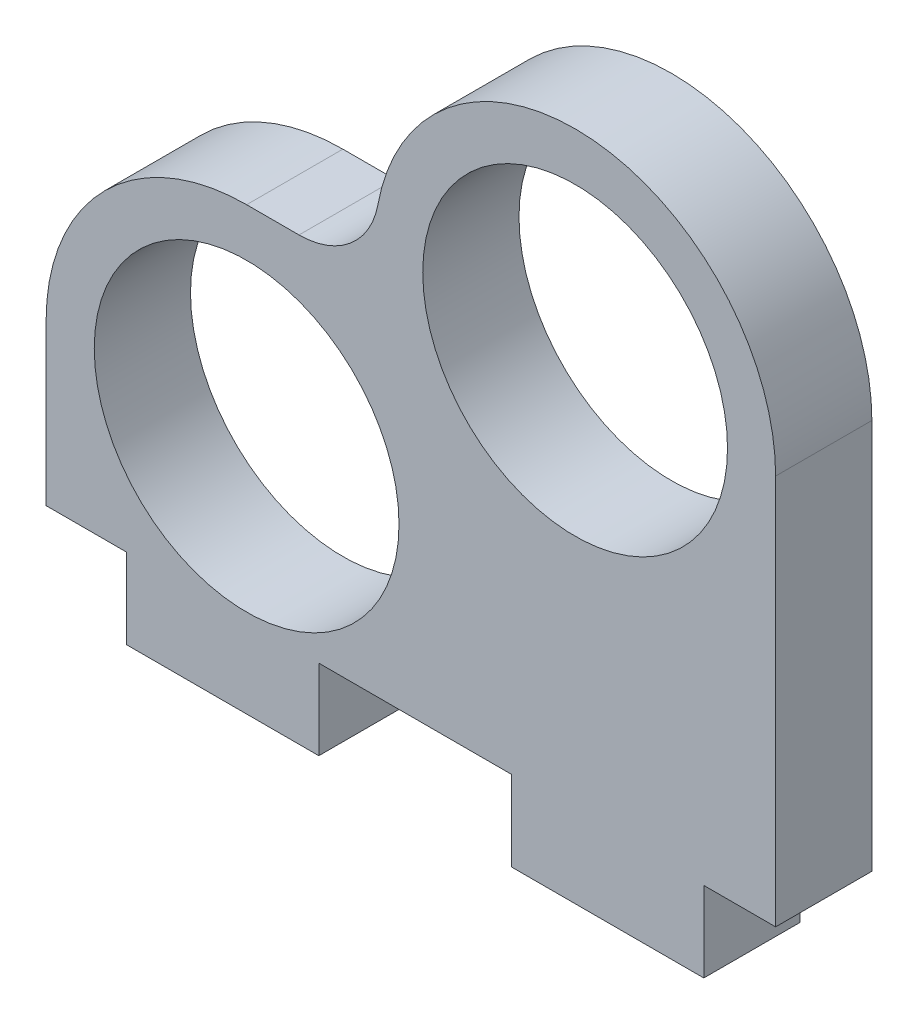
ISO-10303-21;
HEADER;
FILE_DESCRIPTION(('STEP AP214'),'2;1');
FILE_NAME('part.step','',(''),(''),'','','');
FILE_SCHEMA(('AUTOMOTIVE_DESIGN { 1 0 10303 214 1 1 1 1 }'));
ENDSEC;
DATA;
#1=APPLICATION_CONTEXT('core data for automotive mechanical design processes');
#2=APPLICATION_PROTOCOL_DEFINITION('international standard','automotive_design',2000,#1);
#3=PRODUCT_CONTEXT('',#1,'mechanical');
#4=PRODUCT('Part','Part','',(#3));
#5=PRODUCT_RELATED_PRODUCT_CATEGORY('part','',(#4));
#6=PRODUCT_DEFINITION_FORMATION('','',#4);
#7=PRODUCT_DEFINITION_CONTEXT('part definition',#1,'design');
#8=PRODUCT_DEFINITION('design','',#6,#7);
#9=PRODUCT_DEFINITION_SHAPE('','',#8);
#10=(LENGTH_UNIT() NAMED_UNIT(*) SI_UNIT(.MILLI.,.METRE.));
#11=(NAMED_UNIT(*) PLANE_ANGLE_UNIT() SI_UNIT($,.RADIAN.));
#12=(NAMED_UNIT(*) SI_UNIT($,.STERADIAN.) SOLID_ANGLE_UNIT());
#13=UNCERTAINTY_MEASURE_WITH_UNIT(LENGTH_MEASURE(1.E-05),#10,'distance_accuracy_value','');
#14=(GEOMETRIC_REPRESENTATION_CONTEXT(3) GLOBAL_UNCERTAINTY_ASSIGNED_CONTEXT((#13)) GLOBAL_UNIT_ASSIGNED_CONTEXT((#10,
#11,#12)) REPRESENTATION_CONTEXT('',''));
#15=CARTESIAN_POINT('',(0.,0.,0.));
#16=DIRECTION('',(0.,0.,1.));
#17=DIRECTION('',(1.,0.,0.));
#18=AXIS2_PLACEMENT_3D('',#15,#16,#17);
#19=CARTESIAN_POINT('',(20.4788011072248,14.3394109087762,6.));
#20=DIRECTION('',(0.,0.,1.));
#21=DIRECTION('',(1.,0.,0.));
#22=AXIS2_PLACEMENT_3D('',#19,#20,#21);
#23=PLANE('',#22);
#24=CARTESIAN_POINT('',(0.,0.,6.));
#25=DIRECTION('',(0.,0.,1.));
#26=DIRECTION('',(1.,0.,0.));
#27=AXIS2_PLACEMENT_3D('',#24,#25,#26);
#28=CIRCLE('',#27,9.5);
#29=CARTESIAN_POINT('',(9.5,0.,6.));
#30=VERTEX_POINT('',#29);
#31=EDGE_CURVE('E176',#30,#30,#28,.T.);
#32=ORIENTED_EDGE('',*,*,#31,.F.);
#33=EDGE_LOOP('',(#32));
#34=FACE_BOUND('',#33,.T.);
#35=DIRECTION('',(1.,0.,0.));
#36=VECTOR('',#35,1.);
#37=CARTESIAN_POINT('',(-12.5,-10.,6.));
#38=LINE('',#37,#36);
#39=CARTESIAN_POINT('',(-12.5,-10.,6.));
#40=VERTEX_POINT('',#39);
#41=CARTESIAN_POINT('',(-7.5,-10.,6.));
#42=VERTEX_POINT('',#41);
#43=EDGE_CURVE('E201',#40,#42,#38,.T.);
#44=ORIENTED_EDGE('',*,*,#43,.T.);
#45=DIRECTION('',(0.,-1.,0.));
#46=VECTOR('',#45,1.);
#47=CARTESIAN_POINT('',(-7.5,-15.,6.));
#48=LINE('',#47,#46);
#49=CARTESIAN_POINT('',(-7.5,-15.,6.));
#50=VERTEX_POINT('',#49);
#51=EDGE_CURVE('E114',#42,#50,#48,.T.);
#52=ORIENTED_EDGE('',*,*,#51,.T.);
#53=DIRECTION('',(1.,0.,0.));
#54=VECTOR('',#53,1.);
#55=CARTESIAN_POINT('',(4.5,-15.,6.));
#56=LINE('',#55,#54);
#57=CARTESIAN_POINT('',(4.5,-15.,6.));
#58=VERTEX_POINT('',#57);
#59=EDGE_CURVE('E237',#50,#58,#56,.T.);
#60=ORIENTED_EDGE('',*,*,#59,.T.);
#61=DIRECTION('',(0.,1.,0.));
#62=VECTOR('',#61,1.);
#63=CARTESIAN_POINT('',(4.5,-15.,6.));
#64=LINE('',#63,#62);
#65=CARTESIAN_POINT('',(4.5,-10.,6.));
#66=VERTEX_POINT('',#65);
#67=EDGE_CURVE('E256',#58,#66,#64,.T.);
#68=ORIENTED_EDGE('',*,*,#67,.T.);
#69=DIRECTION('',(1.,0.,0.));
#70=VECTOR('',#69,1.);
#71=CARTESIAN_POINT('',(16.5,-10.,6.));
#72=LINE('',#71,#70);
#73=CARTESIAN_POINT('',(16.5,-10.,6.));
#74=VERTEX_POINT('',#73);
#75=EDGE_CURVE('E253',#66,#74,#72,.T.);
#76=ORIENTED_EDGE('',*,*,#75,.T.);
#77=DIRECTION('',(0.,-1.,0.));
#78=VECTOR('',#77,1.);
#79=CARTESIAN_POINT('',(16.5,-15.,6.));
#80=LINE('',#79,#78);
#81=CARTESIAN_POINT('',(16.5,-15.,6.));
#82=VERTEX_POINT('',#81);
#83=EDGE_CURVE('E255',#74,#82,#80,.T.);
#84=ORIENTED_EDGE('',*,*,#83,.T.);
#85=DIRECTION('',(1.,0.,0.));
#86=VECTOR('',#85,1.);
#87=CARTESIAN_POINT('',(28.5,-15.,6.));
#88=LINE('',#87,#86);
#89=CARTESIAN_POINT('',(28.5,-15.,6.));
#90=VERTEX_POINT('',#89);
#91=EDGE_CURVE('E258',#82,#90,#88,.T.);
#92=ORIENTED_EDGE('',*,*,#91,.T.);
#93=DIRECTION('',(0.,1.,0.));
#94=VECTOR('',#93,1.);
#95=CARTESIAN_POINT('',(28.5,-15.,6.));
#96=LINE('',#95,#94);
#97=CARTESIAN_POINT('',(28.5,-10.,6.));
#98=VERTEX_POINT('',#97);
#99=EDGE_CURVE('E264',#90,#98,#96,.T.);
#100=ORIENTED_EDGE('',*,*,#99,.T.);
#101=DIRECTION('',(1.,0.,0.));
#102=VECTOR('',#101,1.);
#103=CARTESIAN_POINT('',(32.9788011072248,-10.,6.));
#104=LINE('',#103,#102);
#105=CARTESIAN_POINT('',(32.9788011072248,-10.,6.));
#106=VERTEX_POINT('',#105);
#107=EDGE_CURVE('E266',#98,#106,#104,.T.);
#108=ORIENTED_EDGE('',*,*,#107,.T.);
#109=DIRECTION('',(0.,1.,0.));
#110=VECTOR('',#109,1.);
#111=CARTESIAN_POINT('',(32.9788011072248,14.3394109087762,6.));
#112=LINE('',#111,#110);
#113=CARTESIAN_POINT('',(32.9788011072248,14.3394109087762,6.));
#114=VERTEX_POINT('',#113);
#115=EDGE_CURVE('E268',#106,#114,#112,.T.);
#116=ORIENTED_EDGE('',*,*,#115,.T.);
#117=CARTESIAN_POINT('',(20.4788011072248,14.3394109087762,6.));
#118=DIRECTION('',(0.,0.,1.));
#119=DIRECTION('',(1.,0.,0.));
#120=AXIS2_PLACEMENT_3D('',#117,#118,#119);
#121=CIRCLE('',#120,12.5);
#122=CARTESIAN_POINT('',(8.18435494536968,16.5969745453646,6.));
#123=VERTEX_POINT('',#122);
#124=EDGE_CURVE('E270',#114,#123,#121,.T.);
#125=ORIENTED_EDGE('',*,*,#124,.T.);
#126=CARTESIAN_POINT('',(3.26657648062764,17.5,6.));
#127=DIRECTION('',(0.,0.,-1.));
#128=DIRECTION('',(1.,0.,0.));
#129=AXIS2_PLACEMENT_3D('',#126,#127,#128);
#130=CIRCLE('',#129,5.);
#131=CARTESIAN_POINT('',(3.26657648062764,12.5,6.));
#132=VERTEX_POINT('',#131);
#133=EDGE_CURVE('E154',#123,#132,#130,.T.);
#134=ORIENTED_EDGE('',*,*,#133,.T.);
#135=DIRECTION('',(-1.,0.,0.));
#136=VECTOR('',#135,1.);
#137=CARTESIAN_POINT('',(0.,12.5,6.));
#138=LINE('',#137,#136);
#139=CARTESIAN_POINT('',(0.,12.5,6.));
#140=VERTEX_POINT('',#139);
#141=EDGE_CURVE('E148',#132,#140,#138,.T.);
#142=ORIENTED_EDGE('',*,*,#141,.T.);
#143=CARTESIAN_POINT('',(0.,0.,6.));
#144=DIRECTION('',(0.,0.,1.));
#145=DIRECTION('',(1.,0.,0.));
#146=AXIS2_PLACEMENT_3D('',#143,#144,#145);
#147=CIRCLE('',#146,12.5);
#148=CARTESIAN_POINT('',(-12.5,0.,6.));
#149=VERTEX_POINT('',#148);
#150=EDGE_CURVE('E152',#140,#149,#147,.T.);
#151=ORIENTED_EDGE('',*,*,#150,.T.);
#152=DIRECTION('',(0.,-1.,0.));
#153=VECTOR('',#152,1.);
#154=CARTESIAN_POINT('',(-12.5,0.,6.));
#155=LINE('',#154,#153);
#156=EDGE_CURVE('E50',#149,#40,#155,.T.);
#157=ORIENTED_EDGE('',*,*,#156,.T.);
#158=EDGE_LOOP('',(#44,#52,#60,#68,#76,#84,#92,#100,#108,#116,#125,#134,#142,#151,#157));
#159=FACE_BOUND('',#158,.T.);
#160=CARTESIAN_POINT('',(20.4788011072248,14.3394109087762,6.));
#161=DIRECTION('',(0.,0.,1.));
#162=DIRECTION('',(1.,0.,0.));
#163=AXIS2_PLACEMENT_3D('',#160,#161,#162);
#164=CIRCLE('',#163,9.5);
#165=CARTESIAN_POINT('',(29.9788011072248,14.3394109087762,6.));
#166=VERTEX_POINT('',#165);
#167=EDGE_CURVE('E312',#166,#166,#164,.T.);
#168=ORIENTED_EDGE('',*,*,#167,.F.);
#169=EDGE_LOOP('',(#168));
#170=FACE_BOUND('',#169,.T.);
#171=ADVANCED_FACE('F33',(#34,#159,#170),#23,.T.);
#172=CARTESIAN_POINT('',(20.4788011072248,14.3394109087762,0.));
#173=DIRECTION('',(0.,0.,1.));
#174=DIRECTION('',(1.,0.,0.));
#175=AXIS2_PLACEMENT_3D('',#172,#173,#174);
#176=PLANE('',#175);
#177=DIRECTION('',(1.,0.,0.));
#178=VECTOR('',#177,1.);
#179=CARTESIAN_POINT('',(-12.5,-10.,0.));
#180=LINE('',#179,#178);
#181=CARTESIAN_POINT('',(-12.5,-10.,0.));
#182=VERTEX_POINT('',#181);
#183=CARTESIAN_POINT('',(-7.5,-10.,0.));
#184=VERTEX_POINT('',#183);
#185=EDGE_CURVE('E172',#182,#184,#180,.T.);
#186=ORIENTED_EDGE('',*,*,#185,.F.);
#187=DIRECTION('',(0.,-1.,0.));
#188=VECTOR('',#187,1.);
#189=CARTESIAN_POINT('',(-12.5,0.,0.));
#190=LINE('',#189,#188);
#191=CARTESIAN_POINT('',(-12.5,0.,0.));
#192=VERTEX_POINT('',#191);
#193=EDGE_CURVE('E106',#192,#182,#190,.T.);
#194=ORIENTED_EDGE('',*,*,#193,.F.);
#195=CARTESIAN_POINT('',(0.,0.,0.));
#196=DIRECTION('',(0.,0.,1.));
#197=DIRECTION('',(1.,0.,0.));
#198=AXIS2_PLACEMENT_3D('',#195,#196,#197);
#199=CIRCLE('',#198,12.5);
#200=CARTESIAN_POINT('',(0.,12.5,0.));
#201=VERTEX_POINT('',#200);
#202=EDGE_CURVE('E100',#201,#192,#199,.T.);
#203=ORIENTED_EDGE('',*,*,#202,.F.);
#204=DIRECTION('',(-1.,0.,0.));
#205=VECTOR('',#204,1.);
#206=CARTESIAN_POINT('',(0.,12.5,0.));
#207=LINE('',#206,#205);
#208=CARTESIAN_POINT('',(3.26657648062764,12.5,0.));
#209=VERTEX_POINT('',#208);
#210=EDGE_CURVE('E162',#209,#201,#207,.T.);
#211=ORIENTED_EDGE('',*,*,#210,.F.);
#212=CARTESIAN_POINT('',(3.26657648062764,17.5,0.));
#213=DIRECTION('',(0.,0.,-1.));
#214=DIRECTION('',(1.,0.,0.));
#215=AXIS2_PLACEMENT_3D('',#212,#213,#214);
#216=CIRCLE('',#215,5.);
#217=CARTESIAN_POINT('',(8.18435494536968,16.5969745453646,0.));
#218=VERTEX_POINT('',#217);
#219=EDGE_CURVE('E196',#218,#209,#216,.T.);
#220=ORIENTED_EDGE('',*,*,#219,.F.);
#221=CARTESIAN_POINT('',(20.4788011072248,14.3394109087762,0.));
#222=DIRECTION('',(0.,0.,1.));
#223=DIRECTION('',(1.,0.,0.));
#224=AXIS2_PLACEMENT_3D('',#221,#222,#223);
#225=CIRCLE('',#224,12.5);
#226=CARTESIAN_POINT('',(32.9788011072248,14.3394109087762,0.));
#227=VERTEX_POINT('',#226);
#228=EDGE_CURVE('E194',#227,#218,#225,.T.);
#229=ORIENTED_EDGE('',*,*,#228,.F.);
#230=DIRECTION('',(0.,1.,0.));
#231=VECTOR('',#230,1.);
#232=CARTESIAN_POINT('',(32.9788011072248,14.3394109087762,0.));
#233=LINE('',#232,#231);
#234=CARTESIAN_POINT('',(32.9788011072248,-10.,0.));
#235=VERTEX_POINT('',#234);
#236=EDGE_CURVE('E192',#235,#227,#233,.T.);
#237=ORIENTED_EDGE('',*,*,#236,.F.);
#238=DIRECTION('',(1.,0.,0.));
#239=VECTOR('',#238,1.);
#240=CARTESIAN_POINT('',(32.9788011072248,-10.,0.));
#241=LINE('',#240,#239);
#242=CARTESIAN_POINT('',(28.5,-10.,0.));
#243=VERTEX_POINT('',#242);
#244=EDGE_CURVE('E190',#243,#235,#241,.T.);
#245=ORIENTED_EDGE('',*,*,#244,.F.);
#246=DIRECTION('',(0.,1.,0.));
#247=VECTOR('',#246,1.);
#248=CARTESIAN_POINT('',(28.5,-15.,0.));
#249=LINE('',#248,#247);
#250=CARTESIAN_POINT('',(28.5,-15.,0.));
#251=VERTEX_POINT('',#250);
#252=EDGE_CURVE('E188',#251,#243,#249,.T.);
#253=ORIENTED_EDGE('',*,*,#252,.F.);
#254=DIRECTION('',(1.,0.,0.));
#255=VECTOR('',#254,1.);
#256=CARTESIAN_POINT('',(28.5,-15.,0.));
#257=LINE('',#256,#255);
#258=CARTESIAN_POINT('',(16.5,-15.,0.));
#259=VERTEX_POINT('',#258);
#260=EDGE_CURVE('E186',#259,#251,#257,.T.);
#261=ORIENTED_EDGE('',*,*,#260,.F.);
#262=DIRECTION('',(0.,-1.,0.));
#263=VECTOR('',#262,1.);
#264=CARTESIAN_POINT('',(16.5,-15.,0.));
#265=LINE('',#264,#263);
#266=CARTESIAN_POINT('',(16.5,-10.,0.));
#267=VERTEX_POINT('',#266);
#268=EDGE_CURVE('E184',#267,#259,#265,.T.);
#269=ORIENTED_EDGE('',*,*,#268,.F.);
#270=DIRECTION('',(1.,0.,0.));
#271=VECTOR('',#270,1.);
#272=CARTESIAN_POINT('',(16.5,-10.,0.));
#273=LINE('',#272,#271);
#274=CARTESIAN_POINT('',(4.5,-10.,0.));
#275=VERTEX_POINT('',#274);
#276=EDGE_CURVE('E182',#275,#267,#273,.T.);
#277=ORIENTED_EDGE('',*,*,#276,.F.);
#278=DIRECTION('',(0.,1.,0.));
#279=VECTOR('',#278,1.);
#280=CARTESIAN_POINT('',(4.5,-15.,0.));
#281=LINE('',#280,#279);
#282=CARTESIAN_POINT('',(4.5,-15.,0.));
#283=VERTEX_POINT('',#282);
#284=EDGE_CURVE('E180',#283,#275,#281,.T.);
#285=ORIENTED_EDGE('',*,*,#284,.F.);
#286=DIRECTION('',(1.,0.,0.));
#287=VECTOR('',#286,1.);
#288=CARTESIAN_POINT('',(4.5,-15.,0.));
#289=LINE('',#288,#287);
#290=CARTESIAN_POINT('',(-7.5,-15.,0.));
#291=VERTEX_POINT('',#290);
#292=EDGE_CURVE('E178',#291,#283,#289,.T.);
#293=ORIENTED_EDGE('',*,*,#292,.F.);
#294=DIRECTION('',(0.,-1.,0.));
#295=VECTOR('',#294,1.);
#296=CARTESIAN_POINT('',(-7.5,-15.,0.));
#297=LINE('',#296,#295);
#298=EDGE_CURVE('E175',#184,#291,#297,.T.);
#299=ORIENTED_EDGE('',*,*,#298,.F.);
#300=EDGE_LOOP('',(#186,#194,#203,#211,#220,#229,#237,#245,#253,#261,#269,#277,#285,#293,#299));
#301=FACE_BOUND('',#300,.T.);
#302=CARTESIAN_POINT('',(0.,0.,0.));
#303=DIRECTION('',(0.,0.,1.));
#304=DIRECTION('',(1.,0.,0.));
#305=AXIS2_PLACEMENT_3D('',#302,#303,#304);
#306=CIRCLE('',#305,9.5);
#307=CARTESIAN_POINT('',(9.5,0.,0.));
#308=VERTEX_POINT('',#307);
#309=EDGE_CURVE('E318',#308,#308,#306,.T.);
#310=ORIENTED_EDGE('',*,*,#309,.T.);
#311=EDGE_LOOP('',(#310));
#312=FACE_BOUND('',#311,.T.);
#313=CARTESIAN_POINT('',(20.4788011072248,14.3394109087762,0.));
#314=DIRECTION('',(0.,0.,1.));
#315=DIRECTION('',(1.,0.,0.));
#316=AXIS2_PLACEMENT_3D('',#313,#314,#315);
#317=CIRCLE('',#316,9.5);
#318=CARTESIAN_POINT('',(29.9788011072248,14.3394109087762,0.));
#319=VERTEX_POINT('',#318);
#320=EDGE_CURVE('E315',#319,#319,#317,.T.);
#321=ORIENTED_EDGE('',*,*,#320,.T.);
#322=EDGE_LOOP('',(#321));
#323=FACE_BOUND('',#322,.T.);
#324=ADVANCED_FACE('F241',(#301,#312,#323),#176,.F.);
#325=CARTESIAN_POINT('',(-12.5,-10.,6.));
#326=DIRECTION('',(0.,1.,0.));
#327=DIRECTION('',(-1.,0.,0.));
#328=AXIS2_PLACEMENT_3D('',#325,#326,#327);
#329=PLANE('',#328);
#330=ORIENTED_EDGE('',*,*,#185,.T.);
#331=DIRECTION('',(0.,0.,-1.));
#332=VECTOR('',#331,1.);
#333=CARTESIAN_POINT('',(-7.5,-10.,6.));
#334=LINE('',#333,#332);
#335=EDGE_CURVE('E11',#42,#184,#334,.T.);
#336=ORIENTED_EDGE('',*,*,#335,.F.);
#337=ORIENTED_EDGE('',*,*,#43,.F.);
#338=DIRECTION('',(0.,0.,-1.));
#339=VECTOR('',#338,1.);
#340=CARTESIAN_POINT('',(-12.5,-10.,6.));
#341=LINE('',#340,#339);
#342=EDGE_CURVE('E168',#40,#182,#341,.T.);
#343=ORIENTED_EDGE('',*,*,#342,.T.);
#344=EDGE_LOOP('',(#330,#336,#337,#343));
#345=FACE_BOUND('',#344,.T.);
#346=ADVANCED_FACE('F35',(#345),#329,.F.);
#347=CARTESIAN_POINT('',(-7.5,-15.,6.));
#348=DIRECTION('',(1.,0.,0.));
#349=DIRECTION('',(0.,0.,-1.));
#350=AXIS2_PLACEMENT_3D('',#347,#348,#349);
#351=PLANE('',#350);
#352=ORIENTED_EDGE('',*,*,#298,.T.);
#353=DIRECTION('',(0.,0.,-1.));
#354=VECTOR('',#353,1.);
#355=CARTESIAN_POINT('',(-7.5,-15.,6.));
#356=LINE('',#355,#354);
#357=EDGE_CURVE('E42',#50,#291,#356,.T.);
#358=ORIENTED_EDGE('',*,*,#357,.F.);
#359=ORIENTED_EDGE('',*,*,#51,.F.);
#360=ORIENTED_EDGE('',*,*,#335,.T.);
#361=EDGE_LOOP('',(#352,#358,#359,#360));
#362=FACE_BOUND('',#361,.T.);
#363=ADVANCED_FACE('F441',(#362),#351,.F.);
#364=CARTESIAN_POINT('',(4.5,-15.,6.));
#365=DIRECTION('',(0.,1.,0.));
#366=DIRECTION('',(-1.,0.,0.));
#367=AXIS2_PLACEMENT_3D('',#364,#365,#366);
#368=PLANE('',#367);
#369=ORIENTED_EDGE('',*,*,#292,.T.);
#370=DIRECTION('',(0.,0.,-1.));
#371=VECTOR('',#370,1.);
#372=CARTESIAN_POINT('',(4.5,-15.,6.));
#373=LINE('',#372,#371);
#374=EDGE_CURVE('E229',#58,#283,#373,.T.);
#375=ORIENTED_EDGE('',*,*,#374,.F.);
#376=ORIENTED_EDGE('',*,*,#59,.F.);
#377=ORIENTED_EDGE('',*,*,#357,.T.);
#378=EDGE_LOOP('',(#369,#375,#376,#377));
#379=FACE_BOUND('',#378,.T.);
#380=ADVANCED_FACE('F235',(#379),#368,.F.);
#381=CARTESIAN_POINT('',(4.5,-15.,6.));
#382=DIRECTION('',(-1.,0.,0.));
#383=DIRECTION('',(0.,0.,1.));
#384=AXIS2_PLACEMENT_3D('',#381,#382,#383);
#385=PLANE('',#384);
#386=ORIENTED_EDGE('',*,*,#284,.T.);
#387=DIRECTION('',(0.,0.,-1.));
#388=VECTOR('',#387,1.);
#389=CARTESIAN_POINT('',(4.5,-10.,6.));
#390=LINE('',#389,#388);
#391=EDGE_CURVE('E226',#66,#275,#390,.T.);
#392=ORIENTED_EDGE('',*,*,#391,.F.);
#393=ORIENTED_EDGE('',*,*,#67,.F.);
#394=ORIENTED_EDGE('',*,*,#374,.T.);
#395=EDGE_LOOP('',(#386,#392,#393,#394));
#396=FACE_BOUND('',#395,.T.);
#397=ADVANCED_FACE('F247',(#396),#385,.F.);
#398=CARTESIAN_POINT('',(16.5,-10.,6.));
#399=DIRECTION('',(0.,1.,0.));
#400=DIRECTION('',(-1.,0.,0.));
#401=AXIS2_PLACEMENT_3D('',#398,#399,#400);
#402=PLANE('',#401);
#403=ORIENTED_EDGE('',*,*,#276,.T.);
#404=DIRECTION('',(0.,0.,-1.));
#405=VECTOR('',#404,1.);
#406=CARTESIAN_POINT('',(16.5,-10.,6.));
#407=LINE('',#406,#405);
#408=EDGE_CURVE('E223',#74,#267,#407,.T.);
#409=ORIENTED_EDGE('',*,*,#408,.F.);
#410=ORIENTED_EDGE('',*,*,#75,.F.);
#411=ORIENTED_EDGE('',*,*,#391,.T.);
#412=EDGE_LOOP('',(#403,#409,#410,#411));
#413=FACE_BOUND('',#412,.T.);
#414=ADVANCED_FACE('F251',(#413),#402,.F.);
#415=CARTESIAN_POINT('',(16.5,-15.,6.));
#416=DIRECTION('',(1.,0.,0.));
#417=DIRECTION('',(0.,0.,-1.));
#418=AXIS2_PLACEMENT_3D('',#415,#416,#417);
#419=PLANE('',#418);
#420=ORIENTED_EDGE('',*,*,#268,.T.);
#421=DIRECTION('',(0.,0.,-1.));
#422=VECTOR('',#421,1.);
#423=CARTESIAN_POINT('',(16.5,-15.,6.));
#424=LINE('',#423,#422);
#425=EDGE_CURVE('E220',#82,#259,#424,.T.);
#426=ORIENTED_EDGE('',*,*,#425,.F.);
#427=ORIENTED_EDGE('',*,*,#83,.F.);
#428=ORIENTED_EDGE('',*,*,#408,.T.);
#429=EDGE_LOOP('',(#420,#426,#427,#428));
#430=FACE_BOUND('',#429,.T.);
#431=ADVANCED_FACE('F406',(#430),#419,.F.);
#432=CARTESIAN_POINT('',(28.5,-15.,6.));
#433=DIRECTION('',(0.,1.,0.));
#434=DIRECTION('',(-1.,0.,0.));
#435=AXIS2_PLACEMENT_3D('',#432,#433,#434);
#436=PLANE('',#435);
#437=ORIENTED_EDGE('',*,*,#260,.T.);
#438=DIRECTION('',(0.,0.,-1.));
#439=VECTOR('',#438,1.);
#440=CARTESIAN_POINT('',(28.5,-15.,6.));
#441=LINE('',#440,#439);
#442=EDGE_CURVE('E217',#90,#251,#441,.T.);
#443=ORIENTED_EDGE('',*,*,#442,.F.);
#444=ORIENTED_EDGE('',*,*,#91,.F.);
#445=ORIENTED_EDGE('',*,*,#425,.T.);
#446=EDGE_LOOP('',(#437,#443,#444,#445));
#447=FACE_BOUND('',#446,.T.);
#448=ADVANCED_FACE('F396',(#447),#436,.F.);
#449=CARTESIAN_POINT('',(28.5,-15.,6.));
#450=DIRECTION('',(-1.,0.,0.));
#451=DIRECTION('',(0.,0.,1.));
#452=AXIS2_PLACEMENT_3D('',#449,#450,#451);
#453=PLANE('',#452);
#454=ORIENTED_EDGE('',*,*,#252,.T.);
#455=DIRECTION('',(0.,0.,-1.));
#456=VECTOR('',#455,1.);
#457=CARTESIAN_POINT('',(28.5,-10.,6.));
#458=LINE('',#457,#456);
#459=EDGE_CURVE('E214',#98,#243,#458,.T.);
#460=ORIENTED_EDGE('',*,*,#459,.F.);
#461=ORIENTED_EDGE('',*,*,#99,.F.);
#462=ORIENTED_EDGE('',*,*,#442,.T.);
#463=EDGE_LOOP('',(#454,#460,#461,#462));
#464=FACE_BOUND('',#463,.T.);
#465=ADVANCED_FACE('F386',(#464),#453,.F.);
#466=CARTESIAN_POINT('',(32.9788011072248,-10.,6.));
#467=DIRECTION('',(0.,1.,0.));
#468=DIRECTION('',(0.,0.,1.));
#469=AXIS2_PLACEMENT_3D('',#466,#467,#468);
#470=PLANE('',#469);
#471=ORIENTED_EDGE('',*,*,#244,.T.);
#472=DIRECTION('',(0.,0.,-1.));
#473=VECTOR('',#472,1.);
#474=CARTESIAN_POINT('',(32.9788011072248,-10.,6.));
#475=LINE('',#474,#473);
#476=EDGE_CURVE('E211',#106,#235,#475,.T.);
#477=ORIENTED_EDGE('',*,*,#476,.F.);
#478=ORIENTED_EDGE('',*,*,#107,.F.);
#479=ORIENTED_EDGE('',*,*,#459,.T.);
#480=EDGE_LOOP('',(#471,#477,#478,#479));
#481=FACE_BOUND('',#480,.T.);
#482=ADVANCED_FACE('F376',(#481),#470,.F.);
#483=CARTESIAN_POINT('',(32.9788011072248,14.3394109087762,6.));
#484=DIRECTION('',(-1.,0.,0.));
#485=DIRECTION('',(0.,-1.,0.));
#486=AXIS2_PLACEMENT_3D('',#483,#484,#485);
#487=PLANE('',#486);
#488=ORIENTED_EDGE('',*,*,#236,.T.);
#489=DIRECTION('',(0.,0.,-1.));
#490=VECTOR('',#489,1.);
#491=CARTESIAN_POINT('',(32.9788011072248,14.3394109087762,6.));
#492=LINE('',#491,#490);
#493=EDGE_CURVE('E208',#114,#227,#492,.T.);
#494=ORIENTED_EDGE('',*,*,#493,.F.);
#495=ORIENTED_EDGE('',*,*,#115,.F.);
#496=ORIENTED_EDGE('',*,*,#476,.T.);
#497=EDGE_LOOP('',(#488,#494,#495,#496));
#498=FACE_BOUND('',#497,.T.);
#499=ADVANCED_FACE('F367',(#498),#487,.F.);
#500=CARTESIAN_POINT('',(20.4788011072248,14.3394109087762,6.));
#501=DIRECTION('',(0.,0.,-1.));
#502=DIRECTION('',(-1.,0.,0.));
#503=AXIS2_PLACEMENT_3D('',#500,#501,#502);
#504=CYLINDRICAL_SURFACE('',#503,12.5);
#505=ORIENTED_EDGE('',*,*,#228,.T.);
#506=DIRECTION('',(0.,0.,-1.));
#507=VECTOR('',#506,1.);
#508=CARTESIAN_POINT('',(8.18435494536968,16.5969745453646,6.));
#509=LINE('',#508,#507);
#510=EDGE_CURVE('E205',#123,#218,#509,.T.);
#511=ORIENTED_EDGE('',*,*,#510,.F.);
#512=ORIENTED_EDGE('',*,*,#124,.F.);
#513=ORIENTED_EDGE('',*,*,#493,.T.);
#514=EDGE_LOOP('',(#505,#511,#512,#513));
#515=FACE_BOUND('',#514,.T.);
#516=ADVANCED_FACE('F276',(#515),#504,.T.);
#517=CARTESIAN_POINT('',(3.26657648062764,17.5,6.));
#518=DIRECTION('',(0.,0.,-1.));
#519=DIRECTION('',(-1.,0.,0.));
#520=AXIS2_PLACEMENT_3D('',#517,#518,#519);
#521=CYLINDRICAL_SURFACE('',#520,5.);
#522=ORIENTED_EDGE('',*,*,#219,.T.);
#523=DIRECTION('',(0.,0.,-1.));
#524=VECTOR('',#523,1.);
#525=CARTESIAN_POINT('',(3.26657648062764,12.5,6.));
#526=LINE('',#525,#524);
#527=EDGE_CURVE('E163',#132,#209,#526,.T.);
#528=ORIENTED_EDGE('',*,*,#527,.F.);
#529=ORIENTED_EDGE('',*,*,#133,.F.);
#530=ORIENTED_EDGE('',*,*,#510,.T.);
#531=EDGE_LOOP('',(#522,#528,#529,#530));
#532=FACE_BOUND('',#531,.T.);
#533=ADVANCED_FACE('F280',(#532),#521,.F.);
#534=CARTESIAN_POINT('',(0.,12.5,6.));
#535=DIRECTION('',(0.,-1.,0.));
#536=DIRECTION('',(0.,0.,-1.));
#537=AXIS2_PLACEMENT_3D('',#534,#535,#536);
#538=PLANE('',#537);
#539=ORIENTED_EDGE('',*,*,#210,.T.);
#540=DIRECTION('',(0.,0.,-1.));
#541=VECTOR('',#540,1.);
#542=CARTESIAN_POINT('',(0.,12.5,6.));
#543=LINE('',#542,#541);
#544=EDGE_CURVE('E159',#140,#201,#543,.T.);
#545=ORIENTED_EDGE('',*,*,#544,.F.);
#546=ORIENTED_EDGE('',*,*,#141,.F.);
#547=ORIENTED_EDGE('',*,*,#527,.T.);
#548=EDGE_LOOP('',(#539,#545,#546,#547));
#549=FACE_BOUND('',#548,.T.);
#550=ADVANCED_FACE('F160',(#549),#538,.F.);
#551=CARTESIAN_POINT('',(0.,0.,6.));
#552=DIRECTION('',(0.,0.,-1.));
#553=DIRECTION('',(-1.,0.,0.));
#554=AXIS2_PLACEMENT_3D('',#551,#552,#553);
#555=CYLINDRICAL_SURFACE('',#554,12.5);
#556=ORIENTED_EDGE('',*,*,#202,.T.);
#557=DIRECTION('',(0.,0.,-1.));
#558=VECTOR('',#557,1.);
#559=CARTESIAN_POINT('',(-12.5,0.,6.));
#560=LINE('',#559,#558);
#561=EDGE_CURVE('E164',#149,#192,#560,.T.);
#562=ORIENTED_EDGE('',*,*,#561,.F.);
#563=ORIENTED_EDGE('',*,*,#150,.F.);
#564=ORIENTED_EDGE('',*,*,#544,.T.);
#565=EDGE_LOOP('',(#556,#562,#563,#564));
#566=FACE_BOUND('',#565,.T.);
#567=ADVANCED_FACE('F166',(#566),#555,.T.);
#568=CARTESIAN_POINT('',(-12.5,0.,6.));
#569=DIRECTION('',(1.,0.,0.));
#570=DIRECTION('',(0.,1.,0.));
#571=AXIS2_PLACEMENT_3D('',#568,#569,#570);
#572=PLANE('',#571);
#573=ORIENTED_EDGE('',*,*,#193,.T.);
#574=ORIENTED_EDGE('',*,*,#342,.F.);
#575=ORIENTED_EDGE('',*,*,#156,.F.);
#576=ORIENTED_EDGE('',*,*,#561,.T.);
#577=EDGE_LOOP('',(#573,#574,#575,#576));
#578=FACE_BOUND('',#577,.T.);
#579=ADVANCED_FACE('F284',(#578),#572,.F.);
#580=CARTESIAN_POINT('',(0.,0.,6.));
#581=DIRECTION('',(0.,0.,-1.));
#582=DIRECTION('',(-1.,0.,0.));
#583=AXIS2_PLACEMENT_3D('',#580,#581,#582);
#584=CYLINDRICAL_SURFACE('',#583,9.5);
#585=ORIENTED_EDGE('',*,*,#31,.T.);
#586=EDGE_LOOP('',(#585));
#587=FACE_BOUND('',#586,.T.);
#588=ORIENTED_EDGE('',*,*,#309,.F.);
#589=EDGE_LOOP('',(#588));
#590=FACE_BOUND('',#589,.T.);
#591=ADVANCED_FACE('F286',(#587,#590),#584,.F.);
#592=CARTESIAN_POINT('',(20.4788011072248,14.3394109087762,6.));
#593=DIRECTION('',(0.,0.,-1.));
#594=DIRECTION('',(-1.,0.,0.));
#595=AXIS2_PLACEMENT_3D('',#592,#593,#594);
#596=CYLINDRICAL_SURFACE('',#595,9.5);
#597=ORIENTED_EDGE('',*,*,#167,.T.);
#598=EDGE_LOOP('',(#597));
#599=FACE_BOUND('',#598,.T.);
#600=ORIENTED_EDGE('',*,*,#320,.F.);
#601=EDGE_LOOP('',(#600));
#602=FACE_BOUND('',#601,.T.);
#603=ADVANCED_FACE('F292',(#599,#602),#596,.F.);
#604=CLOSED_SHELL('',(#171,#324,#346,#363,#380,#397,#414,#431,#448,#465,#482,#499,#516,#533,
#550,#567,#579,#591,#603));
#605=MANIFOLD_SOLID_BREP('B2',#604);
#606=ADVANCED_BREP_SHAPE_REPRESENTATION('',(#18,#605),#14);
#607=SHAPE_DEFINITION_REPRESENTATION(#9,#606);
ENDSEC;
END-ISO-10303-21;
